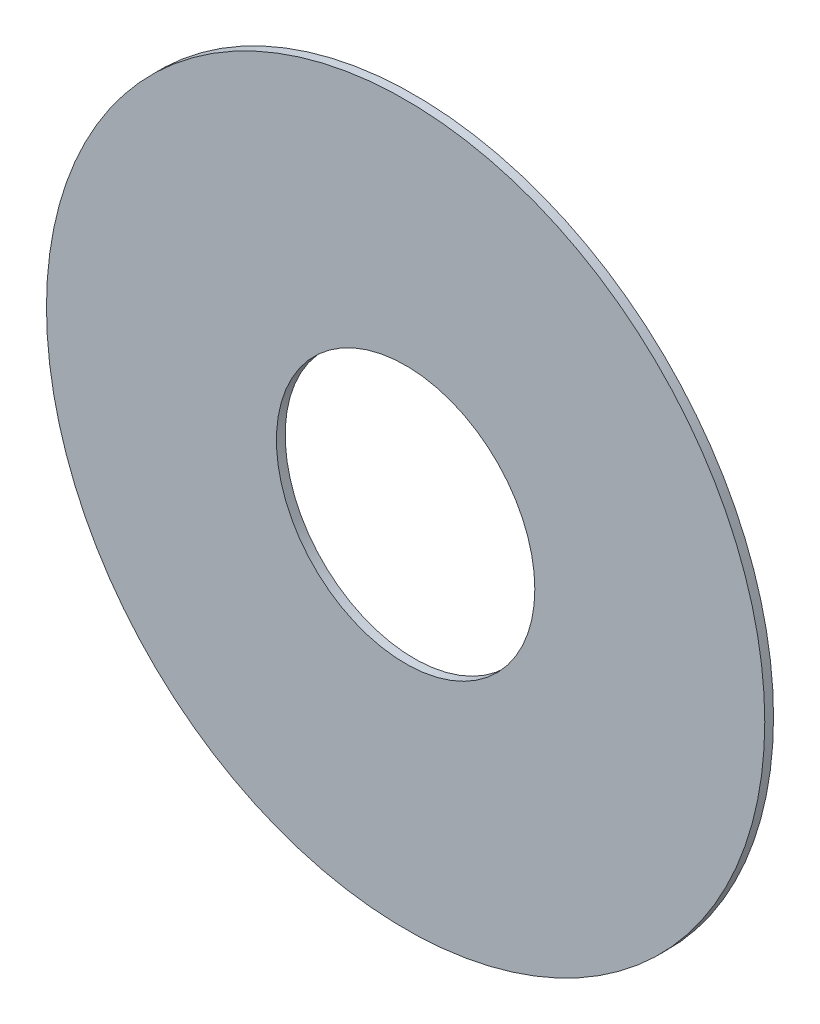
ISO-10303-21;
HEADER;
FILE_DESCRIPTION(('STEP AP214'),'2;1');
FILE_NAME('part.step','',(''),(''),'','','');
FILE_SCHEMA(('AUTOMOTIVE_DESIGN { 1 0 10303 214 1 1 1 1 }'));
ENDSEC;
DATA;
#1=APPLICATION_CONTEXT('core data for automotive mechanical design processes');
#2=APPLICATION_PROTOCOL_DEFINITION('international standard','automotive_design',2000,#1);
#3=PRODUCT_CONTEXT('',#1,'mechanical');
#4=PRODUCT('Part','Part','',(#3));
#5=PRODUCT_RELATED_PRODUCT_CATEGORY('part','',(#4));
#6=PRODUCT_DEFINITION_FORMATION('','',#4);
#7=PRODUCT_DEFINITION_CONTEXT('part definition',#1,'design');
#8=PRODUCT_DEFINITION('design','',#6,#7);
#9=PRODUCT_DEFINITION_SHAPE('','',#8);
#10=(LENGTH_UNIT() NAMED_UNIT(*) SI_UNIT(.MILLI.,.METRE.));
#11=(NAMED_UNIT(*) PLANE_ANGLE_UNIT() SI_UNIT($,.RADIAN.));
#12=(NAMED_UNIT(*) SI_UNIT($,.STERADIAN.) SOLID_ANGLE_UNIT());
#13=UNCERTAINTY_MEASURE_WITH_UNIT(LENGTH_MEASURE(1.E-05),#10,'distance_accuracy_value','');
#14=(GEOMETRIC_REPRESENTATION_CONTEXT(3) GLOBAL_UNCERTAINTY_ASSIGNED_CONTEXT((#13)) GLOBAL_UNIT_ASSIGNED_CONTEXT((#10,
#11,#12)) REPRESENTATION_CONTEXT('',''));
#15=CARTESIAN_POINT('',(0.,0.,0.));
#16=DIRECTION('',(0.,0.,1.));
#17=DIRECTION('',(1.,0.,0.));
#18=AXIS2_PLACEMENT_3D('',#15,#16,#17);
#19=CARTESIAN_POINT('',(0.,0.,42.5));
#20=DIRECTION('',(0.,0.,1.));
#21=DIRECTION('',(1.,0.,0.));
#22=AXIS2_PLACEMENT_3D('',#19,#20,#21);
#23=PLANE('',#22);
#24=CARTESIAN_POINT('',(0.,0.,42.5));
#25=DIRECTION('',(0.,0.,1.));
#26=DIRECTION('',(1.,0.,0.));
#27=AXIS2_PLACEMENT_3D('',#24,#25,#26);
#28=CIRCLE('',#27,82.);
#29=CARTESIAN_POINT('',(82.,0.,42.5));
#30=VERTEX_POINT('',#29);
#31=EDGE_CURVE('E10',#30,#30,#28,.T.);
#32=ORIENTED_EDGE('',*,*,#31,.T.);
#33=EDGE_LOOP('',(#32));
#34=FACE_BOUND('',#33,.T.);
#35=CARTESIAN_POINT('',(0.,0.,42.5));
#36=DIRECTION('',(0.,0.,1.));
#37=DIRECTION('',(1.,0.,0.));
#38=AXIS2_PLACEMENT_3D('',#35,#36,#37);
#39=CIRCLE('',#38,29.5);
#40=CARTESIAN_POINT('',(29.5,0.,42.5));
#41=VERTEX_POINT('',#40);
#42=EDGE_CURVE('E46',#41,#41,#39,.T.);
#43=ORIENTED_EDGE('',*,*,#42,.F.);
#44=EDGE_LOOP('',(#43));
#45=FACE_BOUND('',#44,.T.);
#46=ADVANCED_FACE('F35',(#34,#45),#23,.T.);
#47=CARTESIAN_POINT('',(0.,0.,40.5));
#48=DIRECTION('',(0.,0.,1.));
#49=DIRECTION('',(1.,0.,0.));
#50=AXIS2_PLACEMENT_3D('',#47,#48,#49);
#51=PLANE('',#50);
#52=CARTESIAN_POINT('',(0.,0.,40.5));
#53=DIRECTION('',(0.,0.,1.));
#54=DIRECTION('',(1.,0.,0.));
#55=AXIS2_PLACEMENT_3D('',#52,#53,#54);
#56=CIRCLE('',#55,82.);
#57=CARTESIAN_POINT('',(82.,0.,40.5));
#58=VERTEX_POINT('',#57);
#59=EDGE_CURVE('E39',#58,#58,#56,.T.);
#60=ORIENTED_EDGE('',*,*,#59,.F.);
#61=EDGE_LOOP('',(#60));
#62=FACE_BOUND('',#61,.T.);
#63=CARTESIAN_POINT('',(0.,0.,40.5));
#64=DIRECTION('',(0.,0.,1.));
#65=DIRECTION('',(1.,0.,0.));
#66=AXIS2_PLACEMENT_3D('',#63,#64,#65);
#67=CIRCLE('',#66,29.5);
#68=CARTESIAN_POINT('',(29.5,0.,40.5));
#69=VERTEX_POINT('',#68);
#70=EDGE_CURVE('E48',#69,#69,#67,.T.);
#71=ORIENTED_EDGE('',*,*,#70,.T.);
#72=EDGE_LOOP('',(#71));
#73=FACE_BOUND('',#72,.T.);
#74=ADVANCED_FACE('F58',(#62,#73),#51,.F.);
#75=CARTESIAN_POINT('',(0.,0.,42.5));
#76=DIRECTION('',(0.,0.,-1.));
#77=DIRECTION('',(-1.,0.,0.));
#78=AXIS2_PLACEMENT_3D('',#75,#76,#77);
#79=CYLINDRICAL_SURFACE('',#78,82.);
#80=ORIENTED_EDGE('',*,*,#31,.F.);
#81=EDGE_LOOP('',(#80));
#82=FACE_BOUND('',#81,.T.);
#83=ORIENTED_EDGE('',*,*,#59,.T.);
#84=EDGE_LOOP('',(#83));
#85=FACE_BOUND('',#84,.T.);
#86=ADVANCED_FACE('F37',(#82,#85),#79,.T.);
#87=CARTESIAN_POINT('',(0.,0.,42.5));
#88=DIRECTION('',(0.,0.,-1.));
#89=DIRECTION('',(-1.,0.,0.));
#90=AXIS2_PLACEMENT_3D('',#87,#88,#89);
#91=CYLINDRICAL_SURFACE('',#90,29.5);
#92=ORIENTED_EDGE('',*,*,#42,.T.);
#93=EDGE_LOOP('',(#92));
#94=FACE_BOUND('',#93,.T.);
#95=ORIENTED_EDGE('',*,*,#70,.F.);
#96=EDGE_LOOP('',(#95));
#97=FACE_BOUND('',#96,.T.);
#98=ADVANCED_FACE('F54',(#94,#97),#91,.F.);
#99=CLOSED_SHELL('',(#46,#74,#86,#98));
#100=MANIFOLD_SOLID_BREP('B2',#99);
#101=ADVANCED_BREP_SHAPE_REPRESENTATION('',(#18,#100),#14);
#102=SHAPE_DEFINITION_REPRESENTATION(#9,#101);
ENDSEC;
END-ISO-10303-21;
